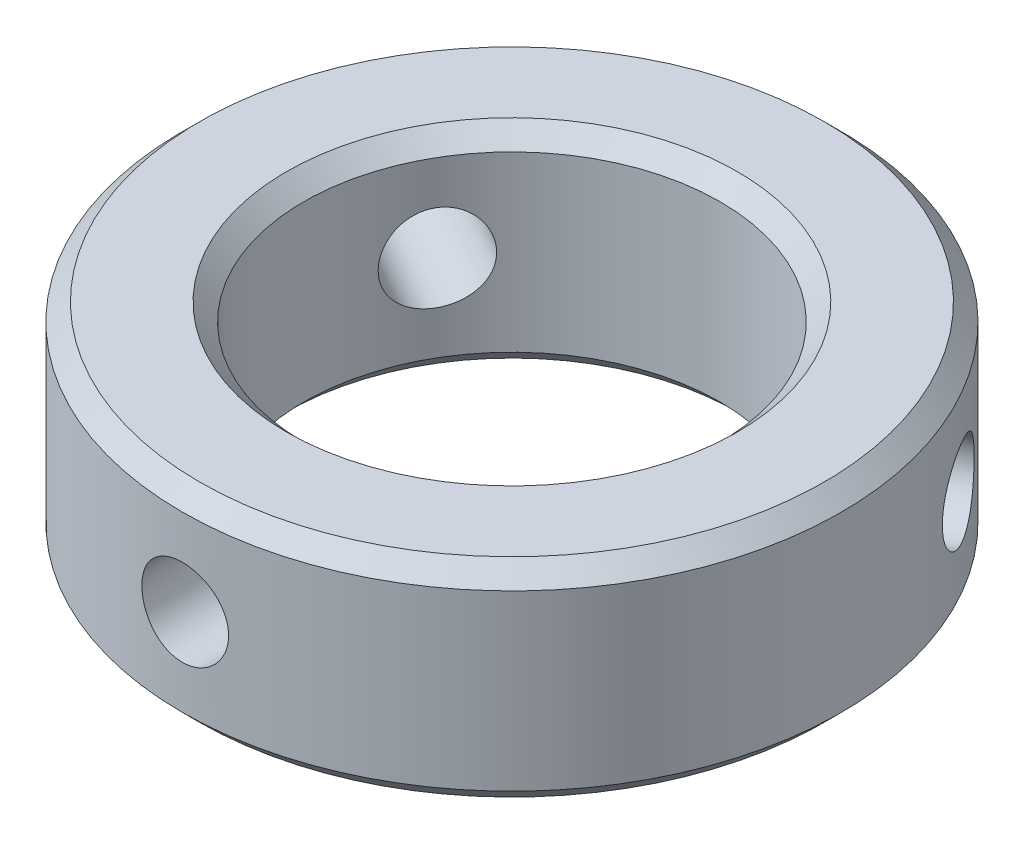
ISO-10303-21;
HEADER;
FILE_DESCRIPTION(('STEP AP214'),'2;1');
FILE_NAME('part.step','',(''),(''),'','','');
FILE_SCHEMA(('AUTOMOTIVE_DESIGN { 1 0 10303 214 1 1 1 1 }'));
ENDSEC;
DATA;
#1=APPLICATION_CONTEXT('core data for automotive mechanical design processes');
#2=APPLICATION_PROTOCOL_DEFINITION('international standard','automotive_design',2000,#1);
#3=PRODUCT_CONTEXT('',#1,'mechanical');
#4=PRODUCT('Part','Part','',(#3));
#5=PRODUCT_RELATED_PRODUCT_CATEGORY('part','',(#4));
#6=PRODUCT_DEFINITION_FORMATION('','',#4);
#7=PRODUCT_DEFINITION_CONTEXT('part definition',#1,'design');
#8=PRODUCT_DEFINITION('design','',#6,#7);
#9=PRODUCT_DEFINITION_SHAPE('','',#8);
#10=(LENGTH_UNIT() NAMED_UNIT(*) SI_UNIT(.MILLI.,.METRE.));
#11=(NAMED_UNIT(*) PLANE_ANGLE_UNIT() SI_UNIT($,.RADIAN.));
#12=(NAMED_UNIT(*) SI_UNIT($,.STERADIAN.) SOLID_ANGLE_UNIT());
#13=UNCERTAINTY_MEASURE_WITH_UNIT(LENGTH_MEASURE(1.E-05),#10,'distance_accuracy_value','');
#14=(GEOMETRIC_REPRESENTATION_CONTEXT(3) GLOBAL_UNCERTAINTY_ASSIGNED_CONTEXT((#13)) GLOBAL_UNIT_ASSIGNED_CONTEXT((#10,
#11,#12)) REPRESENTATION_CONTEXT('',''));
#15=CARTESIAN_POINT('',(0.,0.,0.));
#16=DIRECTION('',(0.,0.,1.));
#17=DIRECTION('',(1.,0.,0.));
#18=AXIS2_PLACEMENT_3D('',#15,#16,#17);
#19=CARTESIAN_POINT('',(0.,6.,0.));
#20=DIRECTION('',(0.,1.,0.));
#21=DIRECTION('',(0.,0.,1.));
#22=AXIS2_PLACEMENT_3D('',#19,#20,#21);
#23=PLANE('',#22);
#24=CARTESIAN_POINT('',(0.,6.,0.));
#25=DIRECTION('',(0.,1.,0.));
#26=DIRECTION('',(0.,0.,1.));
#27=AXIS2_PLACEMENT_3D('',#24,#25,#26);
#28=CIRCLE('',#27,9.);
#29=CARTESIAN_POINT('',(0.,6.,9.));
#30=VERTEX_POINT('',#29);
#31=EDGE_CURVE('E66',#30,#30,#28,.T.);
#32=ORIENTED_EDGE('',*,*,#31,.T.);
#33=EDGE_LOOP('',(#32));
#34=FACE_BOUND('',#33,.T.);
#35=CARTESIAN_POINT('',(0.,6.,0.));
#36=DIRECTION('',(0.,1.,0.));
#37=DIRECTION('',(0.,0.,1.));
#38=AXIS2_PLACEMENT_3D('',#35,#36,#37);
#39=CIRCLE('',#38,6.5);
#40=CARTESIAN_POINT('',(0.,6.,6.5));
#41=VERTEX_POINT('',#40);
#42=EDGE_CURVE('E79',#41,#41,#39,.F.);
#43=ORIENTED_EDGE('',*,*,#42,.T.);
#44=EDGE_LOOP('',(#43));
#45=FACE_BOUND('',#44,.T.);
#46=ADVANCED_FACE('F51',(#34,#45),#23,.T.);
#47=CARTESIAN_POINT('',(0.,0.,0.));
#48=DIRECTION('',(0.,1.,0.));
#49=DIRECTION('',(0.,0.,1.));
#50=AXIS2_PLACEMENT_3D('',#47,#48,#49);
#51=PLANE('',#50);
#52=CARTESIAN_POINT('',(0.,0.,0.));
#53=DIRECTION('',(0.,1.,0.));
#54=DIRECTION('',(0.,0.,1.));
#55=AXIS2_PLACEMENT_3D('',#52,#53,#54);
#56=CIRCLE('',#55,8.99999999999999);
#57=CARTESIAN_POINT('',(0.,0.,8.99999999999999));
#58=VERTEX_POINT('',#57);
#59=EDGE_CURVE('E10',#58,#58,#56,.F.);
#60=ORIENTED_EDGE('',*,*,#59,.T.);
#61=EDGE_LOOP('',(#60));
#62=FACE_BOUND('',#61,.T.);
#63=CARTESIAN_POINT('',(0.,0.,0.));
#64=DIRECTION('',(0.,1.,0.));
#65=DIRECTION('',(0.,0.,1.));
#66=AXIS2_PLACEMENT_3D('',#63,#64,#65);
#67=CIRCLE('',#66,6.5);
#68=CARTESIAN_POINT('',(0.,0.,6.5));
#69=VERTEX_POINT('',#68);
#70=EDGE_CURVE('E78',#69,#69,#67,.T.);
#71=ORIENTED_EDGE('',*,*,#70,.T.);
#72=EDGE_LOOP('',(#71));
#73=FACE_BOUND('',#72,.T.);
#74=ADVANCED_FACE('F173',(#62,#73),#51,.F.);
#75=CARTESIAN_POINT('',(0.,6.,0.));
#76=DIRECTION('',(0.,-1.,0.));
#77=DIRECTION('',(0.,0.,-1.));
#78=AXIS2_PLACEMENT_3D('',#75,#76,#77);
#79=CYLINDRICAL_SURFACE('',#78,9.5);
#80=CARTESIAN_POINT('',(0.,5.5,0.));
#81=DIRECTION('',(0.,1.,0.));
#82=DIRECTION('',(0.,0.,1.));
#83=AXIS2_PLACEMENT_3D('',#80,#81,#82);
#84=CIRCLE('',#83,9.5);
#85=CARTESIAN_POINT('',(0.,5.5,9.5));
#86=VERTEX_POINT('',#85);
#87=EDGE_CURVE('E58',#86,#86,#84,.F.);
#88=ORIENTED_EDGE('',*,*,#87,.T.);
#89=EDGE_LOOP('',(#88));
#90=FACE_BOUND('',#89,.T.);
#91=CARTESIAN_POINT('',(0.,0.500000000000002,0.));
#92=DIRECTION('',(0.,1.,0.));
#93=DIRECTION('',(0.,0.,1.));
#94=AXIS2_PLACEMENT_3D('',#91,#92,#93);
#95=CIRCLE('',#94,9.5);
#96=CARTESIAN_POINT('',(0.,0.500000000000002,9.5));
#97=VERTEX_POINT('',#96);
#98=EDGE_CURVE('E64',#97,#97,#95,.T.);
#99=ORIENTED_EDGE('',*,*,#98,.T.);
#100=EDGE_LOOP('',(#99));
#101=FACE_BOUND('',#100,.T.);
#102=CARTESIAN_POINT('',(-8.78071118909936,3.,-3.62617029572871));
#103=CARTESIAN_POINT('',(-8.78071062192974,2.93011379465119,-3.62617337707279));
#104=CARTESIAN_POINT('',(-8.77845183588832,2.86018467255548,-3.63165628806873));
#105=CARTESIAN_POINT('',(-8.76942082051617,2.72227477521103,-3.65340824645389));
#106=CARTESIAN_POINT('',(-8.76264395198733,2.65429607758202,-3.66968838041604));
#107=CARTESIAN_POINT('',(-8.74461341772239,2.52230357984593,-3.71244812572698));
#108=CARTESIAN_POINT('',(-8.73336288773791,2.45828703876486,-3.73892059248818));
#109=CARTESIAN_POINT('',(-8.70645704664054,2.33596492220363,-3.8011510688992));
#110=CARTESIAN_POINT('',(-8.69080245227795,2.27765841950908,-3.83690756752345));
#111=CARTESIAN_POINT('',(-8.65511491838587,2.16803949801496,-3.91674644637752));
#112=CARTESIAN_POINT('',(-8.63505825191682,2.11676752761631,-3.96087376286224));
#113=CARTESIAN_POINT('',(-8.59083304814015,2.02302277326857,-4.05590045883485));
#114=CARTESIAN_POINT('',(-8.56666430124152,1.98055043807805,-4.10680018348072));
#115=CARTESIAN_POINT('',(-8.5144604687163,1.90546437122733,-4.21396760564728));
#116=CARTESIAN_POINT('',(-8.48641150912022,1.87288742035881,-4.27025433164816));
#117=CARTESIAN_POINT('',(-8.42702440425391,1.81875255294734,-4.38628571652425));
#118=CARTESIAN_POINT('',(-8.39568639377068,1.79719418506955,-4.44603023365242));
#119=CARTESIAN_POINT('',(-8.33060683849444,1.76582977739799,-4.56680033691128));
#120=CARTESIAN_POINT('',(-8.29688027763635,1.75595634411622,-4.62781649072268));
#121=CARTESIAN_POINT('',(-8.22773742309012,1.74803311553219,-4.74965704136351));
#122=CARTESIAN_POINT('',(-8.19232120270669,1.7499828077537,-4.81048144638999));
#123=CARTESIAN_POINT('',(-8.12105846976186,1.76559667926435,-4.92982880644937));
#124=CARTESIAN_POINT('',(-8.08521597019457,1.77918837290104,-4.98836366348031));
#125=CARTESIAN_POINT('',(-8.01402502069592,1.81758700356617,-5.1019504801891));
#126=CARTESIAN_POINT('',(-7.97867658101959,1.84239417303489,-5.15700236765559));
#127=CARTESIAN_POINT('',(-7.90957598579334,1.90259594273984,-5.26237527375157));
#128=CARTESIAN_POINT('',(-7.87582887127691,1.93802170098393,-5.31268178895683));
#129=CARTESIAN_POINT('',(-7.81126524033703,2.01843235628981,-5.40716328155282));
#130=CARTESIAN_POINT('',(-7.78044887287587,2.06341773886708,-5.4513379473299));
#131=CARTESIAN_POINT('',(-7.72270518332515,2.16207612684237,-5.53284224667362));
#132=CARTESIAN_POINT('',(-7.69580907517274,2.2158123342479,-5.57011751823329));
#133=CARTESIAN_POINT('',(-7.6472828811896,2.33023047618093,-5.63655590534409));
#134=CARTESIAN_POINT('',(-7.62565281524948,2.39091243694228,-5.66571899025436));
#135=CARTESIAN_POINT('',(-7.5885753496897,2.51755772705051,-5.71528541842193));
#136=CARTESIAN_POINT('',(-7.57313105959658,2.5835236926697,-5.73568435640538));
#137=CARTESIAN_POINT('',(-7.5491336606266,2.71883386407496,-5.76723308831741));
#138=CARTESIAN_POINT('',(-7.54058018237586,2.78817788857281,-5.77838337800989));
#139=CARTESIAN_POINT('',(-7.53079522439986,2.92772111469758,-5.79113015261714));
#140=CARTESIAN_POINT('',(-7.52950952652376,2.99791005866249,-5.7927973824057));
#141=CARTESIAN_POINT('',(-7.53417388024769,3.13763655644785,-5.78672947455716));
#142=CARTESIAN_POINT('',(-7.54012376049581,3.20717412565477,-5.77899455958029));
#143=CARTESIAN_POINT('',(-7.55895011395923,3.34335692266034,-5.7543470273212));
#144=CARTESIAN_POINT('',(-7.57180042700378,3.41001205346481,-5.7374690700325));
#145=CARTESIAN_POINT('',(-7.60384054286861,3.53884829537357,-5.69493755147116));
#146=CARTESIAN_POINT('',(-7.62303059104764,3.60102923320539,-5.66928365055292));
#147=CARTESIAN_POINT('',(-7.66706059742711,3.71955093973817,-5.6095953466903));
#148=CARTESIAN_POINT('',(-7.69193288194551,3.77585549888484,-5.57551289840223));
#149=CARTESIAN_POINT('',(-7.74624157845442,3.88065603112854,-5.49980964014213));
#150=CARTESIAN_POINT('',(-7.77567818758482,3.92915166676215,-5.45818850455006));
#151=CARTESIAN_POINT('',(-7.8381625161471,4.01726989431143,-5.36807486398728));
#152=CARTESIAN_POINT('',(-7.8712319436772,4.05683429095804,-5.31954047363179));
#153=CARTESIAN_POINT('',(-7.93958199655452,4.12556359939876,-5.21697520040422));
#154=CARTESIAN_POINT('',(-7.97486257324442,4.15472873993872,-5.16294443846593));
#155=CARTESIAN_POINT('',(-8.04627169420194,4.20173630666017,-5.05093126300279));
#156=CARTESIAN_POINT('',(-8.08239742653864,4.21961191690474,-4.99296099078907));
#157=CARTESIAN_POINT('',(-8.15439479277473,4.2436408257752,-4.87448946145042));
#158=CARTESIAN_POINT('',(-8.19026643934441,4.24979471307749,-4.81398833158361));
#159=CARTESIAN_POINT('',(-8.2603938386395,4.25019366185716,-4.69262918933037));
#160=CARTESIAN_POINT('',(-8.29465974658013,4.24452828407511,-4.63177732011108));
#161=CARTESIAN_POINT('',(-8.36094163626228,4.22163976918598,-4.51103092331503));
#162=CARTESIAN_POINT('',(-8.39295762079822,4.20441664643407,-4.45113639454931));
#163=CARTESIAN_POINT('',(-8.45398387233231,4.15893059252178,-4.33411046165837));
#164=CARTESIAN_POINT('',(-8.48299543066811,4.13067242947669,-4.27697787609481));
#165=CARTESIAN_POINT('',(-8.53747215854278,4.06392774970724,-4.16717294247801));
#166=CARTESIAN_POINT('',(-8.5629372675857,4.02544105853544,-4.11450067051559));
#167=CARTESIAN_POINT('',(-8.61010144688856,3.93900219469073,-4.01487455419204));
#168=CARTESIAN_POINT('',(-8.63177190291553,3.89098348067507,-3.96796489303616));
#169=CARTESIAN_POINT('',(-8.67086329172112,3.78698264817583,-3.88180041075255));
#170=CARTESIAN_POINT('',(-8.68828321964538,3.73099865158669,-3.84254740014924));
#171=CARTESIAN_POINT('',(-8.71877399401483,3.61237952083109,-3.77285536179909));
#172=CARTESIAN_POINT('',(-8.73182591390284,3.54971695441198,-3.74245476349173));
#173=CARTESIAN_POINT('',(-8.75337672536822,3.41974623395631,-3.69176938492731));
#174=CARTESIAN_POINT('',(-8.76188051400784,3.35244316497739,-3.67147372611727));
#175=CARTESIAN_POINT('',(-8.77229670721094,3.23733543112762,-3.64649471967978));
#176=CARTESIAN_POINT('',(-8.77545088955714,3.19025340647348,-3.63888612956467));
#177=CARTESIAN_POINT('',(-8.77965831499338,3.0954542589192,-3.6287228873729));
#178=CARTESIAN_POINT('',(-8.78071157651568,3.04773714159469,-3.62616819095628));
#179=CARTESIAN_POINT('',(-8.78071118909936,3.,-3.62617029572871));
#180=B_SPLINE_CURVE_WITH_KNOTS('',3,(#102,#103,#104,#105,#106,#107,#108,#109,#110,#111,#112,
#113,#114,#115,#116,#117,#118,#119,#120,#121,#122,#123,#124,#125,#126,#127,#128,#129,#130,#131,
#132,#133,#134,#135,#136,#137,#138,#139,#140,#141,#142,#143,#144,#145,#146,#147,#148,#149,#150,
#151,#152,#153,#154,#155,#156,#157,#158,#159,#160,#161,#162,#163,#164,#165,#166,#167,#168,#169,
#170,#171,#172,#173,#174,#175,#176,#177,#178,#179),.UNSPECIFIED.,.T.,.F.,(4,2,2,2,2,2,2,2,2,2,2,
2,2,2,2,2,2,2,2,2,2,2,2,2,2,2,2,2,2,2,2,2,2,2,2,2,2,2,4),(0.,0.209484202571715,
0.419183836928699,0.628736743572667,0.838255565722025,1.04893269923857,1.25962057409929,
1.47108224647857,1.68253525643094,1.89276266234727,2.10298095597088,2.31189982011464,
2.5208230142918,2.73036535278699,2.93991833609116,3.15105801722779,3.36219849585734,
3.57344497984326,3.78468013945544,3.99433736908824,4.20398963374582,4.41285264161178,
4.62172373378567,4.83181406846405,5.04191347978169,5.25334471898747,5.46477130718732,
5.67557350690563,5.88636511965188,6.09556525763886,6.30476513579181,6.5138747208992,
6.72298787259743,6.93361567574771,7.14429322463351,7.35587216352337,7.56722283023421,
7.7103163739037,7.85340866214721),.UNSPECIFIED.);
#181=CARTESIAN_POINT('',(-8.78071118909936,3.,-3.62617029572871));
#182=VERTEX_POINT('',#181);
#183=EDGE_CURVE('E95',#182,#182,#180,.T.);
#184=ORIENTED_EDGE('',*,*,#183,.T.);
#185=EDGE_LOOP('',(#184));
#186=FACE_BOUND('',#185,.T.);
#187=CARTESIAN_POINT('',(7.5307111890993,3.,-5.79123380518992));
#188=CARTESIAN_POINT('',(7.53071357403674,2.93011379465119,-5.79123177333459));
#189=CARTESIAN_POINT('',(7.53433252122521,2.86018467255548,-5.78653415174303));
#190=CARTESIAN_POINT('',(7.54865476208274,2.72227477521103,-5.7678370838162));
#191=CARTESIAN_POINT('',(7.55936533740655,2.65429607758202,-5.75382807653104));
#192=CARTESIAN_POINT('',(7.58738109597271,2.52230357984593,-5.71683330315832));
#193=CARTESIAN_POINT('',(7.60468165969651,2.45828703876486,-5.69385382500513));
#194=CARTESIAN_POINT('',(7.64512191260937,2.33596492220363,-5.63943744489911));
#195=CARTESIAN_POINT('',(7.66826065158707,2.27765841950908,-5.60800191918304));
#196=CARTESIAN_POINT('',(7.71955938193832,2.16803949801496,-5.53717616880705));
#197=CARTESIAN_POINT('',(7.74774642578039,2.11676752761631,-5.49774292788725));
#198=CARTESIAN_POINT('',(7.80792935664204,2.02302277326857,-5.41192942994281));
#199=CARTESIAN_POINT('',(7.83992543778168,1.98055043807805,-5.36554881882802));
#200=CARTESIAN_POINT('',(7.90663323157341,1.90546437122733,-5.266755262603));
#201=CARTESIAN_POINT('',(7.94135448638798,1.87288742035881,-5.21432078804263));
#202=CARTESIAN_POINT('',(8.0121470608938,1.81875255294734,-5.10487435413315));
#203=CARTESIAN_POINT('',(8.04821832522202,1.79719418506955,-5.04786258238653));
#204=CARTESIAN_POINT('',(8.12026852502374,1.76582977739799,-4.93111698262088));
#205=CARTESIAN_POINT('',(8.15624678383659,1.75595634411622,-4.87140084722979));
#206=CARTESIAN_POINT('',(8.22719236862951,1.74803311553219,-4.75060110338216));
#207=CARTESIAN_POINT('',(8.26215973836081,1.7499828077537,-4.68951755431085));
#208=CARTESIAN_POINT('',(8.32988621757442,1.76559667926435,-4.56812853720783));
#209=CARTESIAN_POINT('',(8.36265764098646,1.77918837290104,-4.50782059353195));
#210=CARTESIAN_POINT('',(8.42543123504196,1.81758700356617,-4.38937401439219));
#211=CARTESIAN_POINT('',(8.45543334827606,1.84239417303489,-4.3312354239151));
#212=CARTESIAN_POINT('',(8.51213866421264,1.90259594273984,-4.21870609998456));
#213=CARTESIAN_POINT('',(8.53883182709805,1.93802170098393,-4.16432698390627));
#214=CARTESIAN_POINT('',(8.5883733844037,2.01843235628981,-4.06117249305378));
#215=CARTESIAN_POINT('',(8.61122158343976,2.06341773886708,-4.01239740309152));
#216=CARTESIAN_POINT('',(8.65293453241371,2.16207612684237,-3.92163775136049));
#217=CARTESIAN_POINT('',(8.67176781044115,2.2158123342479,-3.87970740265773));
#218=CARTESIAN_POINT('',(8.70504204447399,2.33023047618093,-3.80446329236397));
#219=CARTESIAN_POINT('',(8.71948298388895,2.39091243694228,-3.77114956331916));
#220=CARTESIAN_POINT('',(8.74387003707703,2.51755772705051,-3.71425632215266));
#221=CARTESIAN_POINT('',(8.75381389053437,2.5835236926697,-3.69068170559687));
#222=CARTESIAN_POINT('',(8.76913719434238,2.71883386407496,-3.6541249825081));
#223=CARTESIAN_POINT('',(8.77451688935025,2.78817788857281,-3.641142308206));
#224=CARTESIAN_POINT('',(8.78066344098844,2.92772111469758,-3.6262948987202));
#225=CARTESIAN_POINT('',(8.78146445540123,2.99791005866249,-3.62434783680363));
#226=CARTESIAN_POINT('',(8.77854166991854,3.13763655644785,-3.63142123954505));
#227=CARTESIAN_POINT('',(8.77481797717652,3.20717412565477,-3.64044144447784));
#228=CARTESIAN_POINT('',(8.76288576483126,3.34335692266034,-3.66906931096733));
#229=CARTESIAN_POINT('',(8.75469418157753,3.41001205346481,-3.68863698715485));
#230=CARTESIAN_POINT('',(8.7338808639743,3.53884829537357,-3.73765030071466));
#231=CARTESIAN_POINT('',(8.72125895816244,3.60102923320539,-3.76709632039666));
#232=CARTESIAN_POINT('',(8.69158237389835,3.71955093973817,-3.83507157638138));
#233=CARTESIAN_POINT('',(8.67450225011691,3.77585549888484,-3.8736528307685));
#234=CARTESIAN_POINT('',(8.63609565356886,3.88065603112854,-3.95853717072169));
#235=CARTESIAN_POINT('',(8.61476899737698,3.92915166676215,-4.00484058982593));
#236=CARTESIAN_POINT('',(8.56797045970324,4.01726989431143,-4.10401042598066));
#237=CARTESIAN_POINT('',(8.54247315846325,4.05683429095804,-4.15691658548808));
#238=CARTESIAN_POINT('',(8.48782405274074,4.12556359939876,-4.26739210424364));
#239=CARTESIAN_POINT('',(8.45867232866131,4.15472873993872,-4.3249613608864));
#240=CARTESIAN_POINT('',(8.39737063363043,4.20173630666017,-4.4428100614291));
#241=CARTESIAN_POINT('',(8.36522977139739,4.21961191690474,-4.50308099946986));
#242=CARTESIAN_POINT('',(8.29862910048298,4.2436408257752,-4.62466831230521));
#243=CARTESIAN_POINT('',(8.2641694083455,4.24979471307749,-4.68598463444354));
#244=CARTESIAN_POINT('',(8.19413300782025,4.25019366185716,-4.80739631486104));
#245=CARTESIAN_POINT('',(8.15856669717889,4.24452828407511,-4.86749739623101));
#246=CARTESIAN_POINT('',(8.08713819497915,4.22163976918598,-4.98527239490461));
#247=CARTESIAN_POINT('',(8.05127600378831,4.20441664643407,-5.04294631522277));
#248=CARTESIAN_POINT('',(7.98044169877023,4.15893059252178,-5.1543095657945));
#249=CARTESIAN_POINT('',(7.94546920745619,4.13067242947669,-5.20800060509846));
#250=CARTESIAN_POINT('',(7.87761370942052,4.06392774970724,-5.31008130216137));
#251=CARTESIAN_POINT('',(7.84473073834748,4.02544105853544,-5.3584708694839));
#252=CARTESIAN_POINT('',(7.78203408038234,3.93900219469073,-5.44912930507059));
#253=CARTESIAN_POINT('',(7.75224435015191,3.89098348067507,-5.49135130107949));
#254=CARTESIAN_POINT('',(7.69716941399316,3.78698264817582,-5.56828767799614));
#255=CARTESIAN_POINT('',(7.67188527359781,3.73099865158669,-5.6030002834123));
#256=CARTESIAN_POINT('',(7.62677558512978,3.61237952083108,-5.66425208777238));
#257=CARTESIAN_POINT('',(7.60697385464937,3.54971695441198,-5.69075568111723));
#258=CARTESIAN_POINT('',(7.57385443494484,3.41974623395631,-5.73476192060063));
#259=CARTESIAN_POINT('',(7.56052977314861,3.35244316497739,-5.75227424699597));
#260=CARTESIAN_POINT('',(7.544105415614,3.23733543112762,-5.77378443813933));
#261=CARTESIAN_POINT('',(7.53909327446043,3.19025340647348,-5.78032033523686));
#262=CARTESIAN_POINT('',(7.53239536125567,3.0954542589192,-5.78904569364506));
#263=CARTESIAN_POINT('',(7.53070956002107,3.04773714159469,-5.79123519308851));
#264=CARTESIAN_POINT('',(7.5307111890993,3.,-5.79123380518992));
#265=B_SPLINE_CURVE_WITH_KNOTS('',3,(#187,#188,#189,#190,#191,#192,#193,#194,#195,#196,#197,
#198,#199,#200,#201,#202,#203,#204,#205,#206,#207,#208,#209,#210,#211,#212,#213,#214,#215,#216,
#217,#218,#219,#220,#221,#222,#223,#224,#225,#226,#227,#228,#229,#230,#231,#232,#233,#234,#235,
#236,#237,#238,#239,#240,#241,#242,#243,#244,#245,#246,#247,#248,#249,#250,#251,#252,#253,#254,
#255,#256,#257,#258,#259,#260,#261,#262,#263,#264),.UNSPECIFIED.,.T.,.F.,(4,2,2,2,2,2,2,2,2,2,2,
2,2,2,2,2,2,2,2,2,2,2,2,2,2,2,2,2,2,2,2,2,2,2,2,2,2,2,4),(0.,0.209484202571715,
0.419183836928699,0.628736743572667,0.838255565722025,1.04893269923857,1.25962057409929,
1.47108224647857,1.68253525643094,1.89276266234727,2.10298095597087,2.31189982011463,
2.5208230142918,2.73036535278698,2.93991833609116,3.15105801722779,3.36219849585734,
3.57344497984326,3.78468013945544,3.99433736908824,4.20398963374582,4.41285264161178,
4.62172373378567,4.83181406846405,5.04191347978168,5.25334471898747,5.46477130718732,
5.67557350690563,5.88636511965188,6.09556525763886,6.30476513579181,6.5138747208992,
6.72298787259743,6.93361567574771,7.14429322463351,7.35587216352337,7.56722283023421,
7.7103163739037,7.85340866214721),.UNSPECIFIED.);
#266=CARTESIAN_POINT('',(7.5307111890993,3.,-5.79123380518992));
#267=VERTEX_POINT('',#266);
#268=EDGE_CURVE('E101',#267,#267,#265,.T.);
#269=ORIENTED_EDGE('',*,*,#268,.T.);
#270=EDGE_LOOP('',(#269));
#271=FACE_BOUND('',#270,.T.);
#272=CARTESIAN_POINT('',(1.25,3.,9.41740410091868));
#273=CARTESIAN_POINT('',(1.24999704789294,2.93011379465119,9.41740515040742));
#274=CARTESIAN_POINT('',(1.24411931466306,2.86018467255548,9.41819043981181));
#275=CARTESIAN_POINT('',(1.22076605843337,2.72227477521103,9.42124533027014));
#276=CARTESIAN_POINT('',(1.20327861458071,2.65429607758202,9.42351645694713));
#277=CARTESIAN_POINT('',(1.15723232174961,2.52230357984593,9.42928142888536));
#278=CARTESIAN_POINT('',(1.12868122804134,2.45828703876486,9.43277441749336));
#279=CARTESIAN_POINT('',(1.06133513403111,2.33596492220363,9.44058851379835));
#280=CARTESIAN_POINT('',(1.02254180069082,2.27765841950908,9.44490948670654));
#281=CARTESIAN_POINT('',(0.935555536447495,2.16803949801496,9.45392261518461));
#282=CARTESIAN_POINT('',(0.887311826136364,2.11676752761631,9.45861669074954));
#283=CARTESIAN_POINT('',(0.782903691498048,2.02302277326857,9.4678298887777));
#284=CARTESIAN_POINT('',(0.726738863459773,1.98055043807805,9.47234900230879));
#285=CARTESIAN_POINT('',(0.607827237142835,1.90546437122733,9.48072286825033));
#286=CARTESIAN_POINT('',(0.545057022732175,1.87288742035881,9.48457511969083));
#287=CARTESIAN_POINT('',(0.414877343360044,1.81875255294734,9.49116007065744));
#288=CARTESIAN_POINT('',(0.3474680685486,1.79719418506955,9.49389281603898));
#289=CARTESIAN_POINT('',(0.210338313470635,1.76582977739799,9.4979173195322));
#290=CARTESIAN_POINT('',(0.140633493799697,1.75595634411622,9.4992173379525));
#291=CARTESIAN_POINT('',(0.00054505446053656,1.74803311553219,9.50025814474571));
#292=CARTESIAN_POINT('',(-0.0698385356541859,1.7499828077537,9.49999900070087));
#293=CARTESIAN_POINT('',(-0.20882774781263,1.76559667926435,9.49795734365723));
#294=CARTESIAN_POINT('',(-0.27744167079196,1.77918837290104,9.4961842570123));
#295=CARTESIAN_POINT('',(-0.411406214346103,1.81758700356617,9.49132449458133));
#296=CARTESIAN_POINT('',(-0.476756767256533,1.84239417303489,9.48823779157073));
#297=CARTESIAN_POINT('',(-0.602562678419365,1.90259594273984,9.48108137373616));
#298=CARTESIAN_POINT('',(-0.663002955821205,1.93802170098393,9.47700877286313));
#299=CARTESIAN_POINT('',(-0.777108144066743,2.01843235628981,9.46833577460663));
#300=CARTESIAN_POINT('',(-0.83077271056396,2.06341773886708,9.46373535042145));
#301=CARTESIAN_POINT('',(-0.930229349088633,2.16207612684237,9.45447999803414));
#302=CARTESIAN_POINT('',(-0.975958735268481,2.2158123342479,9.44982492089105));
#303=CARTESIAN_POINT('',(-1.05775916328446,2.33023047618093,9.44101919770808));
#304=CARTESIAN_POINT('',(-1.09383016863954,2.39091243694228,9.43686855357354));
#305=CARTESIAN_POINT('',(-1.1552946873874,2.51755772705051,9.42954174057461));
#306=CARTESIAN_POINT('',(-1.18068283093786,2.5835236926697,9.42636606200228));
#307=CARTESIAN_POINT('',(-1.22000353371585,2.71883386407496,9.42135807082555));
#308=CARTESIAN_POINT('',(-1.23393670697446,2.78817788857281,9.41952568621592));
#309=CARTESIAN_POINT('',(-1.24986821658865,2.92772111469758,9.41742505133737));
#310=CARTESIAN_POINT('',(-1.25195492887754,2.99791005866249,9.41714521920936));
#311=CARTESIAN_POINT('',(-1.24436778967092,3.13763655644785,9.41815071410225));
#312=CARTESIAN_POINT('',(-1.23469421668077,3.20717412565477,9.41943600405816));
#313=CARTESIAN_POINT('',(-1.2039356508721,3.34335692266034,9.42341633828856));
#314=CARTESIAN_POINT('',(-1.18289375457382,3.41001205346481,9.42610605718737));
#315=CARTESIAN_POINT('',(-1.13004032110575,3.53884829537357,9.43258785218585));
#316=CARTESIAN_POINT('',(-1.09822836711488,3.60102923320539,9.43637997094961));
#317=CARTESIAN_POINT('',(-1.02452177647131,3.71955093973816,9.44466692307171));
#318=CARTESIAN_POINT('',(-0.982569368171472,3.77585549888484,9.44916572917077));
#319=CARTESIAN_POINT('',(-0.889854075114515,3.88065603112854,9.45834681086385));
#320=CARTESIAN_POINT('',(-0.83909080979222,3.92915166676215,9.46302909437602));
#321=CARTESIAN_POINT('',(-0.729807943556216,4.01726989431143,9.47208528996797));
#322=CARTESIAN_POINT('',(-0.671241214786125,4.05683429095804,9.47645705911991));
#323=CARTESIAN_POINT('',(-0.548242056186292,4.12556359939876,9.48436730464789));
#324=CARTESIAN_POINT('',(-0.48380975541696,4.15472873993872,9.48790579935237));
#325=CARTESIAN_POINT('',(-0.35109893942855,4.20173630666017,9.49374132443193));
#326=CARTESIAN_POINT('',(-0.28283234485882,4.21961191690474,9.49604199025896));
#327=CARTESIAN_POINT('',(-0.144234307708316,4.2436408257752,9.49915777375567));
#328=CARTESIAN_POINT('',(-0.0739029690011531,4.24979471307749,9.49997296602718));
#329=CARTESIAN_POINT('',(0.0662608308191816,4.25019366185716,9.50002550419145));
#330=CARTESIAN_POINT('',(0.136093049401174,4.24452828407511,9.49927471634213));
#331=CARTESIAN_POINT('',(0.273803441283064,4.22163976918598,9.49630331821968));
#332=CARTESIAN_POINT('',(0.341681617009847,4.20441664643407,9.49408270977212));
#333=CARTESIAN_POINT('',(0.473542173562016,4.15893059252178,9.48842002745291));
#334=CARTESIAN_POINT('',(0.537526223211852,4.13067242947669,9.4849784811933));
#335=CARTESIAN_POINT('',(0.659858449122197,4.06392774970724,9.47725424463942));
#336=CARTESIAN_POINT('',(0.718206529238157,4.02544105853544,9.47297153999953));
#337=CARTESIAN_POINT('',(0.828067366506166,3.93900219469073,9.46400385926268));
#338=CARTESIAN_POINT('',(0.879527552763564,3.89098348067507,9.45931619411569));
#339=CARTESIAN_POINT('',(0.9736938777279,3.78698264817582,9.45008808874873));
#340=CARTESIAN_POINT('',(1.01639794604752,3.73099865158669,9.44554768356159));
#341=CARTESIAN_POINT('',(1.09199840888499,3.61237952083108,9.43710744957151));
#342=CARTESIAN_POINT('',(1.12485205925341,3.54971695441198,9.43321044460901));
#343=CARTESIAN_POINT('',(1.17952229042332,3.41974623395631,9.42653130552799));
#344=CARTESIAN_POINT('',(1.20135074085917,3.35244316497739,9.42374797311328));
#345=CARTESIAN_POINT('',(1.22819129159688,3.23733543112762,9.42027915781915));
#346=CARTESIAN_POINT('',(1.23635761509664,3.19025340647348,9.41920646480158));
#347=CARTESIAN_POINT('',(1.24726295373765,3.0954542589192,9.41776858101801));
#348=CARTESIAN_POINT('',(1.25000201649455,3.04773714159469,9.41740338404484));
#349=CARTESIAN_POINT('',(1.25,3.,9.41740410091868));
#350=B_SPLINE_CURVE_WITH_KNOTS('',3,(#272,#273,#274,#275,#276,#277,#278,#279,#280,#281,#282,
#283,#284,#285,#286,#287,#288,#289,#290,#291,#292,#293,#294,#295,#296,#297,#298,#299,#300,#301,
#302,#303,#304,#305,#306,#307,#308,#309,#310,#311,#312,#313,#314,#315,#316,#317,#318,#319,#320,
#321,#322,#323,#324,#325,#326,#327,#328,#329,#330,#331,#332,#333,#334,#335,#336,#337,#338,#339,
#340,#341,#342,#343,#344,#345,#346,#347,#348,#349),.UNSPECIFIED.,.T.,.F.,(4,2,2,2,2,2,2,2,2,2,2,
2,2,2,2,2,2,2,2,2,2,2,2,2,2,2,2,2,2,2,2,2,2,2,2,2,2,2,4),(0.,0.209484202571714,
0.419183836928699,0.628736743572667,0.838255565722023,1.04893269923857,1.25962057409929,
1.47108224647857,1.68253525643094,1.89276266234727,2.10298095597088,2.31189982011463,
2.5208230142918,2.73036535278698,2.93991833609116,3.15105801722779,3.36219849585734,
3.57344497984326,3.78468013945544,3.99433736908824,4.20398963374582,4.41285264161178,
4.62172373378567,4.83181406846404,5.04191347978168,5.25334471898747,5.46477130718732,
5.67557350690563,5.88636511965188,6.09556525763885,6.30476513579181,6.5138747208992,
6.72298787259742,6.93361567574771,7.14429322463351,7.35587216352337,7.56722283023421,
7.7103163739037,7.85340866214721),.UNSPECIFIED.);
#351=CARTESIAN_POINT('',(1.25,3.,9.41740410091868));
#352=VERTEX_POINT('',#351);
#353=EDGE_CURVE('E149',#352,#352,#350,.T.);
#354=ORIENTED_EDGE('',*,*,#353,.T.);
#355=EDGE_LOOP('',(#354));
#356=FACE_BOUND('',#355,.T.);
#357=ADVANCED_FACE('F110',(#90,#101,#186,#271,#356),#79,.T.);
#358=CARTESIAN_POINT('',(0.,6.,0.));
#359=DIRECTION('',(0.,-1.,0.));
#360=DIRECTION('',(0.,0.,-1.));
#361=AXIS2_PLACEMENT_3D('',#358,#359,#360);
#362=CYLINDRICAL_SURFACE('',#361,6.);
#363=CARTESIAN_POINT('',(0.,5.5,0.));
#364=DIRECTION('',(0.,1.,0.));
#365=DIRECTION('',(0.,0.,1.));
#366=AXIS2_PLACEMENT_3D('',#363,#364,#365);
#367=CIRCLE('',#366,6.);
#368=CARTESIAN_POINT('',(0.,5.5,6.));
#369=VERTEX_POINT('',#368);
#370=EDGE_CURVE('E85',#369,#369,#367,.T.);
#371=ORIENTED_EDGE('',*,*,#370,.T.);
#372=EDGE_LOOP('',(#371));
#373=FACE_BOUND('',#372,.T.);
#374=CARTESIAN_POINT('',(0.,0.500000000000006,0.));
#375=DIRECTION('',(0.,1.,0.));
#376=DIRECTION('',(0.,0.,1.));
#377=AXIS2_PLACEMENT_3D('',#374,#375,#376);
#378=CIRCLE('',#377,6.);
#379=CARTESIAN_POINT('',(0.,0.500000000000006,6.));
#380=VERTEX_POINT('',#379);
#381=EDGE_CURVE('E86',#380,#380,#378,.F.);
#382=ORIENTED_EDGE('',*,*,#381,.T.);
#383=EDGE_LOOP('',(#382));
#384=FACE_BOUND('',#383,.T.);
#385=CARTESIAN_POINT('',(-5.70713783756405,3.,-1.85164189384578));
#386=CARTESIAN_POINT('',(-5.70713780004337,2.93060938484897,-1.8516447488009));
#387=CARTESIAN_POINT('',(-5.70531646071248,2.86118802798478,-1.8572849352778));
#388=CARTESIAN_POINT('',(-5.69799533361062,2.72431368268275,-1.87962289253197));
#389=CARTESIAN_POINT('',(-5.69249272612532,2.65686224449358,-1.89632913940243));
#390=CARTESIAN_POINT('',(-5.67772267928028,2.52592762716513,-1.94010170743905));
#391=CARTESIAN_POINT('',(-5.66845915141677,2.4624404040082,-1.96715726325628));
#392=CARTESIAN_POINT('',(-5.64604204458465,2.3410755003544,-2.03059994382413));
#393=CARTESIAN_POINT('',(-5.6328886228348,2.28319759326998,-2.06698669142587));
#394=CARTESIAN_POINT('',(-5.60235819594924,2.17380462484654,-2.14836965564533));
#395=CARTESIAN_POINT('',(-5.58492554938411,2.12238810637353,-2.19347747943796));
#396=CARTESIAN_POINT('',(-5.54586370818435,2.0282389313519,-2.29044162162386));
#397=CARTESIAN_POINT('',(-5.52423420598722,1.98550691170856,-2.34229843451851));
#398=CARTESIAN_POINT('',(-5.47661070372347,1.90955411191714,-2.45159471025236));
#399=CARTESIAN_POINT('',(-5.45057722040211,1.87642747353674,-2.50908249631084));
#400=CARTESIAN_POINT('',(-5.39456233793638,1.82123394714022,-2.62735089296269));
#401=CARTESIAN_POINT('',(-5.36458134050839,1.79916593484647,-2.68813116812796));
#402=CARTESIAN_POINT('',(-5.3016645932396,1.76702423888253,-2.8101593576636));
#403=CARTESIAN_POINT('',(-5.26877708169102,1.75678398280484,-2.87138823995521));
#404=CARTESIAN_POINT('',(-5.20049573226464,1.74806830424298,-2.99327941878478));
#405=CARTESIAN_POINT('',(-5.1651021559389,1.7495916558069,-3.05394177370407));
#406=CARTESIAN_POINT('',(-5.09343139364268,1.76423460095674,-3.17201120315475));
#407=CARTESIAN_POINT('',(-5.05717629948895,1.77717471895812,-3.22945408558366));
#408=CARTESIAN_POINT('',(-4.98446882146392,1.81399862533131,-3.34058117045924));
#409=CARTESIAN_POINT('',(-4.94801642930137,1.83788287720308,-3.39426521360258));
#410=CARTESIAN_POINT('',(-4.87598753360544,1.8960800521255,-3.49695720120141));
#411=CARTESIAN_POINT('',(-4.84041860504092,1.93046229420966,-3.5459311286744));
#412=CARTESIAN_POINT('',(-4.77179348095366,2.00862800284042,-3.63775725656609));
#413=CARTESIAN_POINT('',(-4.73873759852211,2.05241263820613,-3.6806086947893));
#414=CARTESIAN_POINT('',(-4.6759152545535,2.14912162489105,-3.76011121189251));
#415=CARTESIAN_POINT('',(-4.64622276092682,2.20220305998195,-3.79662981431034));
#416=CARTESIAN_POINT('',(-4.59222641316152,2.3154820489948,-3.8617679855244));
#417=CARTESIAN_POINT('',(-4.56792267905842,2.37567976138723,-3.89038737836791));
#418=CARTESIAN_POINT('',(-4.5258550867197,2.5017122548288,-3.93924901029057));
#419=CARTESIAN_POINT('',(-4.5081076032484,2.56756065069343,-3.95947028982873));
#420=CARTESIAN_POINT('',(-4.4801936431478,2.70289161936938,-3.99102911052813));
#421=CARTESIAN_POINT('',(-4.47002608624267,2.77237367280809,-4.0023679176131));
#422=CARTESIAN_POINT('',(-4.45795914836417,2.91161970631891,-4.01580392174945));
#423=CARTESIAN_POINT('',(-4.45590999307886,2.98135458453703,-4.01806853530304));
#424=CARTESIAN_POINT('',(-4.45978143640287,3.12032581154014,-4.01377100187183));
#425=CARTESIAN_POINT('',(-4.46570154192925,3.18956219090233,-4.00720940099235));
#426=CARTESIAN_POINT('',(-4.48507620606487,3.32482051605812,-3.98551089980074));
#427=CARTESIAN_POINT('',(-4.49845062061261,3.39086866717883,-3.97046519541919));
#428=CARTESIAN_POINT('',(-4.53197560786413,3.5187239894416,-3.93215475857891));
#429=CARTESIAN_POINT('',(-4.55212677870245,3.5805307856504,-3.90888930061368));
#430=CARTESIAN_POINT('',(-4.59854312067649,3.69910644121623,-3.85417971293582));
#431=CARTESIAN_POINT('',(-4.62489030754918,3.75579220446617,-3.82262514085846));
#432=CARTESIAN_POINT('',(-4.68230962183291,3.86164324915506,-3.75207151809496));
#433=CARTESIAN_POINT('',(-4.71338227895233,3.91080768623923,-3.71307163269044));
#434=CARTESIAN_POINT('',(-4.77945504660065,4.00106271309716,-3.62763951313094));
#435=CARTESIAN_POINT('',(-4.81451227675595,4.04200409502638,-3.58109361739279));
#436=CARTESIAN_POINT('',(-4.88664118282925,4.11358875208798,-3.48202336842941));
#437=CARTESIAN_POINT('',(-4.92371276965579,4.14423248223745,-3.42949927949687));
#438=CARTESIAN_POINT('',(-4.99817531722515,4.19413867931734,-3.32002937084292));
#439=CARTESIAN_POINT('',(-5.03556296898861,4.21346916554434,-3.26311235572929));
#440=CARTESIAN_POINT('',(-5.1095098733485,4.24041440400809,-3.14606052579011));
#441=CARTESIAN_POINT('',(-5.14606923402341,4.24803069353273,-3.08592613426217));
#442=CARTESIAN_POINT('',(-5.21648779492359,4.25126762204851,-2.96530626326824));
#443=CARTESIAN_POINT('',(-5.25038492844487,4.24711189999473,-2.90484881973582));
#444=CARTESIAN_POINT('',(-5.31531842888391,4.22741936134707,-2.78425590465534));
#445=CARTESIAN_POINT('',(-5.34635483823382,4.21188271359323,-2.72412042834412));
#446=CARTESIAN_POINT('',(-5.40484277829978,4.16997220535144,-2.60614690261392));
#447=CARTESIAN_POINT('',(-5.43230364221678,4.14362733614689,-2.54830315769019));
#448=CARTESIAN_POINT('',(-5.483361507194,4.080877602268,-2.43649918022661));
#449=CARTESIAN_POINT('',(-5.50695817153767,4.04447186165686,-2.38253928634506));
#450=CARTESIAN_POINT('',(-5.55050405282907,3.96189033200669,-2.2792769086108));
#451=CARTESIAN_POINT('',(-5.57038273657854,3.9155557119433,-2.23007168869841));
#452=CARTESIAN_POINT('',(-5.60598140766498,3.81475549900291,-2.13901111186473));
#453=CARTESIAN_POINT('',(-5.62170040229302,3.76028797005157,-2.09715751020543));
#454=CARTESIAN_POINT('',(-5.64923802485039,3.64399089756656,-2.0218165497756));
#455=CARTESIAN_POINT('',(-5.66100810356444,3.5820815885379,-1.98843447661826));
#456=CARTESIAN_POINT('',(-5.68052001628665,3.45317484391673,-1.93199151154078));
#457=CARTESIAN_POINT('',(-5.6882653997056,3.38618195154699,-1.9089215278258));
#458=CARTESIAN_POINT('',(-5.69843727419576,3.26589371843156,-1.87829720545254));
#459=CARTESIAN_POINT('',(-5.70170251228723,3.21327046340695,-1.86832483090715));
#460=CARTESIAN_POINT('',(-5.70605276456624,3.10710421947899,-1.85499620643795));
#461=CARTESIAN_POINT('',(-5.70713786652553,3.05356126768996,-1.85163969016138));
#462=CARTESIAN_POINT('',(-5.70713783756405,3.,-1.85164189384578));
#463=B_SPLINE_CURVE_WITH_KNOTS('',3,(#385,#386,#387,#388,#389,#390,#391,#392,#393,#394,#395,
#396,#397,#398,#399,#400,#401,#402,#403,#404,#405,#406,#407,#408,#409,#410,#411,#412,#413,#414,
#415,#416,#417,#418,#419,#420,#421,#422,#423,#424,#425,#426,#427,#428,#429,#430,#431,#432,#433,
#434,#435,#436,#437,#438,#439,#440,#441,#442,#443,#444,#445,#446,#447,#448,#449,#450,#451,#452,
#453,#454,#455,#456,#457,#458,#459,#460,#461,#462),.UNSPECIFIED.,.T.,.F.,(4,2,2,2,2,2,2,2,2,2,2,
2,2,2,2,2,2,2,2,2,2,2,2,2,2,2,2,2,2,2,2,2,2,2,2,2,2,2,4),(0.,0.20797565407127,0.41611079241747,
0.624030014802728,0.83194083481579,1.04271333467885,1.25350128663874,1.46629026266844,
1.67905760106933,1.88879048859264,2.09850151896338,2.30497341416461,2.5114540545587,
2.71932871977949,2.9272292410426,3.13905862244913,3.35089272191628,3.56325237332487,
3.77558175387597,3.98397516009792,4.19235567296524,4.39853786231922,4.6047382546403,
4.81383917934651,5.02296356082185,5.23559458753343,5.4482162175904,5.65954599648534,
5.87084803959581,6.07816293922644,6.28547476332981,6.492234105851,6.69901145528173,
6.90938318978573,7.11980508427535,7.33272651358122,7.54545984571988,7.70599867585769,
7.8665310426116),.UNSPECIFIED.);
#464=CARTESIAN_POINT('',(-5.70713783756405,3.,-1.85164189384578));
#465=VERTEX_POINT('',#464);
#466=EDGE_CURVE('E123',#465,#465,#463,.T.);
#467=ORIENTED_EDGE('',*,*,#466,.F.);
#468=EDGE_LOOP('',(#467));
#469=FACE_BOUND('',#468,.T.);
#470=CARTESIAN_POINT('',(4.45713783756401,3.,-4.01670540330694));
#471=CARTESIAN_POINT('',(4.45714029126734,2.93060938484897,-4.01670394333552));
#472=CARTESIAN_POINT('',(4.46111416637297,2.86118802798478,-4.01230652396761));
#473=CARTESIAN_POINT('',(4.4767988412728,2.72431368268275,-3.99479726328598));
#474=CARTESIAN_POINT('',(4.48851557172186,2.65686224449358,-3.98167874198142));
#475=CARTESIAN_POINT('',(4.51903870420794,2.52592762716513,-3.94700122218022));
#476=CARTESIAN_POINT('',(4.53783773892741,2.4624404040082,-3.92545099381315));
#477=CARTESIAN_POINT('',(4.58157215856729,2.3410755003544,-3.87431586953326));
#478=CARTESIAN_POINT('',(4.60650729547657,2.28319759326998,-3.84473129835032));
#479=CARTESIAN_POINT('',(4.66172179648312,2.17380462484654,-3.77759969096931));
#480=CARTESIAN_POINT('',(4.69206999451441,2.12238810637353,-3.7399486642924));
#481=CARTESIAN_POINT('',(4.75651248430368,2.0282389313519,-3.65763804640187));
#482=CARTESIAN_POINT('',(4.79060705053118,1.98550691170856,-3.61297794158061));
#483=CARTESIAN_POINT('',(4.86144865072385,1.90955411191714,-3.5170866409361));
#484=CARTESIAN_POINT('',(4.89821779219713,1.87642747353674,-3.46579709000156));
#485=CARTESIAN_POINT('',(4.97263378692962,1.82123394714022,-3.35815258047031));
#486=CARTESIAN_POINT('',(5.01028055055776,1.79916593484647,-3.30179813748424));
#487=CARTESIAN_POINT('',(5.08450168903905,1.76702423888253,-3.18629654125816));
#488=CARTESIAN_POINT('',(5.12108370077462,1.75678398280484,-3.12720067964403));
#489=CARTESIAN_POINT('',(5.19250388342507,1.74806830424298,-3.00712170702132));
#490=CARTESIAN_POINT('',(5.2273422356757,1.7495916558069,-2.9461387933328));
#491=CARTESIAN_POINT('',(5.29375797984221,1.76423460095674,-2.82503537775034));
#492=CARTESIAN_POINT('',(5.32537742821539,1.77717471895812,-2.76491610398216));
#493=CARTESIAN_POINT('',(5.38526256775363,1.81399862533131,-2.64638603852959));
#494=CARTESIAN_POINT('',(5.41352811681235,1.83788287720308,-2.58797531931644));
#495=CARTESIAN_POINT('',(5.46644753899008,1.8960800521255,-2.47425047203781));
#496=CARTESIAN_POINT('',(5.49107574002252,1.93046229420966,-2.41895991257905));
#497=CARTESIAN_POINT('',(5.53628693746426,2.00862800284042,-2.31361574783577));
#498=CARTESIAN_POINT('',(5.55686943033848,2.05241263820613,-2.26356279479393));
#499=CARTESIAN_POINT('',(5.59430945783037,2.14912162489105,-2.16940579044023));
#500=CARTESIAN_POINT('',(5.61108924842156,2.20220305998195,-2.1254320354489));
#501=CARTESIAN_POINT('',(5.64050238556635,2.3154820489948,-2.04610074096554));
#502=CARTESIAN_POINT('',(5.65313563975817,2.37567976138723,-2.01074339340368));
#503=CARTESIAN_POINT('',(5.6744172581042,2.5017122548288,-1.94988097380098));
#504=CARTESIAN_POINT('',(5.68305565814563,2.56756065069343,-1.9244005624925));
#505=CARTESIAN_POINT('',(5.69642941853448,2.70289161936938,-1.88444695357546));
#506=CARTESIAN_POINT('',(5.70116533506611,2.77237367280809,-1.86997218745871));
#507=CARTESIAN_POINT('',(5.70676778703429,2.91161970631891,-1.85280391064186));
#508=CARTESIAN_POINT('',(5.7077044222588,2.98135458453703,-1.84989698333169));
#509=CARTESIAN_POINT('',(5.70591837079576,3.12032581154014,-1.8553985183152));
#510=CARTESIAN_POINT('',(5.70319591050783,3.18956219090233,-1.86380628053387));
#511=CARTESIAN_POINT('',(5.69409178931966,3.32482051605812,-1.89143448246091));
#512=CARTESIAN_POINT('',(5.68774903438128,3.39086866717883,-1.91053991741077));
#513=CARTESIAN_POINT('',(5.67133371647327,3.5187239894416,-1.95872862645228));
#514=CARTESIAN_POINT('',(5.66126082426387,3.5805307856504,-1.98781278129688));
#515=CARTESIAN_POINT('',(5.63708910249129,3.69910644121623,-2.05536530643608));
#516=CARTESIAN_POINT('',(5.62293563490309,3.75579220446617,-2.09395992562476));
#517=CARTESIAN_POINT('',(5.59054406240274,3.86164324915506,-2.1789633218441));
#518=CARTESIAN_POINT('',(5.57230549945745,3.91080768623923,-2.22537297497486));
#519=CARTESIAN_POINT('',(5.53135549744395,4.00106271309716,-2.3253097300364));
#520=CARTESIAN_POINT('',(5.50857418437046,4.04200409502638,-2.37894312980629));
#521=CARTESIAN_POINT('',(5.45884128504557,4.11358875208798,-2.49094371929464));
#522=CARTESIAN_POINT('',(5.43188988313263,4.14423248223745,-2.54931069971129));
#523=CARTESIAN_POINT('',(5.37431743507303,4.19413867931735,-2.66853211186384));
#524=CARTESIAN_POINT('',(5.34371967995876,4.21346916554434,-2.72936927563566));
#525=CARTESIAN_POINT('',(5.27932327385193,4.24041440400809,-2.85193508831213));
#526=CARTESIAN_POINT('',(5.24552504348507,4.24803069353273,-2.91366361916669));
#527=CARTESIAN_POINT('',(5.1762744514532,4.25126762204851,-3.03495781730115));
#528=CARTESIAN_POINT('',(5.14086533626691,4.24711189999473,-3.09454231781227));
#529=CARTESIAN_POINT('',(5.06889555851031,4.22741936134707,-3.21107283628936));
#530=CARTESIAN_POINT('',(5.03233491303107,4.21188271359323,-3.26801889338425));
#531=CARTESIAN_POINT('',(4.95941081280769,4.16997220535144,-3.37765769816149));
#532=CARTESIAN_POINT('',(4.92304709221221,4.14362733614689,-3.43036137638534));
#533=CARTESIAN_POINT('',(4.85175093997322,4.080877602268,-3.5304807732504));
#534=CARTESIAN_POINT('',(4.81681863325812,4.04447186165686,-3.57789603095737));
#535=CARTESIAN_POINT('',(4.74916373153077,3.96189033200669,-3.66723905925303));
#536=CARTESIAN_POINT('',(4.71649010296258,3.9155557119433,-3.70905711433007));
#537=CARTESIAN_POINT('',(4.65542866568456,3.81475549900291,-3.78541675624874));
#538=CARTESIAN_POINT('',(4.62704188072176,3.76028797005157,-3.81995660574822));
#539=CARTESIAN_POINT('',(4.57556350632268,3.64399089756656,-3.88147536665765));
#540=CARTESIAN_POINT('',(4.55253882229446,3.5820815885379,-3.90835959040722));
#541=CARTESIAN_POINT('',(4.51341373703355,3.45317484391673,-3.95347888503982));
#542=CARTESIAN_POINT('',(4.49730723678097,3.38618195154699,-3.97172157570017));
#543=CARTESIAN_POINT('',(4.47587173287712,3.26589371843156,-3.99584283859939));
#544=CARTESIAN_POINT('',(4.4688680222305,3.21327046340695,-4.0036568050087));
#545=CARTESIAN_POINT('',(4.45950022098217,3.10710421947899,-4.0140885462298));
#546=CARTESIAN_POINT('',(4.45713594359809,3.05356126768996,-4.01670653023052));
#547=CARTESIAN_POINT('',(4.45713783756401,3.,-4.01670540330694));
#548=B_SPLINE_CURVE_WITH_KNOTS('',3,(#470,#471,#472,#473,#474,#475,#476,#477,#478,#479,#480,
#481,#482,#483,#484,#485,#486,#487,#488,#489,#490,#491,#492,#493,#494,#495,#496,#497,#498,#499,
#500,#501,#502,#503,#504,#505,#506,#507,#508,#509,#510,#511,#512,#513,#514,#515,#516,#517,#518,
#519,#520,#521,#522,#523,#524,#525,#526,#527,#528,#529,#530,#531,#532,#533,#534,#535,#536,#537,
#538,#539,#540,#541,#542,#543,#544,#545,#546,#547),.UNSPECIFIED.,.T.,.F.,(4,2,2,2,2,2,2,2,2,2,2,
2,2,2,2,2,2,2,2,2,2,2,2,2,2,2,2,2,2,2,2,2,2,2,2,2,2,2,4),(0.,0.20797565407127,0.41611079241747,
0.624030014802729,0.831940834815791,1.04271333467885,1.25350128663874,1.46629026266844,
1.67905760106933,1.88879048859264,2.09850151896339,2.30497341416461,2.5114540545587,
2.71932871977949,2.9272292410426,3.13905862244913,3.35089272191628,3.56325237332487,
3.77558175387597,3.98397516009792,4.19235567296524,4.39853786231922,4.60473825464031,
4.81383917934651,5.02296356082185,5.23559458753343,5.4482162175904,5.65954599648534,
5.87084803959581,6.07816293922644,6.28547476332981,6.492234105851,6.69901145528173,
6.90938318978573,7.11980508427535,7.33272651358123,7.54545984571988,7.70599867585769,
7.8665310426116),.UNSPECIFIED.);
#549=CARTESIAN_POINT('',(4.45713783756401,3.,-4.01670540330694));
#550=VERTEX_POINT('',#549);
#551=EDGE_CURVE('E129',#550,#550,#548,.T.);
#552=ORIENTED_EDGE('',*,*,#551,.F.);
#553=EDGE_LOOP('',(#552));
#554=FACE_BOUND('',#553,.T.);
#555=CARTESIAN_POINT('',(1.25,3.,5.86834729715275));
#556=CARTESIAN_POINT('',(1.24999750877599,2.93060938484897,5.86834869213645));
#557=CARTESIAN_POINT('',(1.24420229433948,2.86118802798478,5.86959145924544));
#558=CARTESIAN_POINT('',(1.22119649233779,2.72431368268275,5.87442015581798));
#559=CARTESIAN_POINT('',(1.20397715440342,2.65686224449358,5.87800788138388));
#560=CARTESIAN_POINT('',(1.1586839750723,2.52592762716513,5.8871029296193));
#561=CARTESIAN_POINT('',(1.13062141248932,2.4624404040082,5.89260825706945));
#562=CARTESIAN_POINT('',(1.06446988601732,2.3410755003544,5.90491581335741));
#563=CARTESIAN_POINT('',(1.0263813273582,2.28319759326998,5.91171798977623));
#564=CARTESIAN_POINT('',(0.940636399466082,2.17380462484654,5.92596934661468));
#565=CARTESIAN_POINT('',(0.892855554869668,2.12238810637353,5.93342614373039));
#566=CARTESIAN_POINT('',(0.789351223880636,2.0282389313519,5.94807966802575));
#567=CARTESIAN_POINT('',(0.733627155456002,1.98550691170856,5.95527637609915));
#568=CARTESIAN_POINT('',(0.615162052999588,1.90955411191714,5.96868135118848));
#569=CARTESIAN_POINT('',(0.552359428204941,1.87642747353674,5.97487958631243));
#570=CARTESIAN_POINT('',(0.42192855100672,1.82123394714022,5.98550347343303));
#571=CARTESIAN_POINT('',(0.354300789950591,1.79916593484647,5.98992930561223));
#572=CARTESIAN_POINT('',(0.217162904200503,1.76702423888253,5.99645589892179));
#573=CARTESIAN_POINT('',(0.147693380916358,1.75678398280484,5.99858891959926));
#574=CARTESIAN_POINT('',(0.00799184883952464,1.74806830424298,6.00040112580613));
#575=CARTESIAN_POINT('',(-0.0622400797368383,1.7495916558069,6.0000805670369));
#576=CARTESIAN_POINT('',(-0.200326586199571,1.76423460095674,5.99704658090511));
#577=CARTESIAN_POINT('',(-0.268201128726475,1.77717471895812,5.99437018956584));
#578=CARTESIAN_POINT('',(-0.400793746289752,1.81399862533131,5.98696720898885));
#579=CARTESIAN_POINT('',(-0.465511687511022,1.83788287720308,5.98224053291904));
#580=CARTESIAN_POINT('',(-0.590460005384684,1.8960800521255,5.97120767323924));
#581=CARTESIAN_POINT('',(-0.65065713498165,1.93046229420966,5.96489104125346));
#582=CARTESIAN_POINT('',(-0.764493456510648,2.00862800284042,5.95137300440189));
#583=CARTESIAN_POINT('',(-0.818131831816418,2.05241263820613,5.94417148958325));
#584=CARTESIAN_POINT('',(-0.918394203276912,2.14912162489105,5.92951700233276));
#585=CARTESIAN_POINT('',(-0.964866487494794,2.20220305998195,5.92206184975925));
#586=CARTESIAN_POINT('',(-1.04827597240488,2.3154820489948,5.90786872648996));
#587=CARTESIAN_POINT('',(-1.0852129606998,2.37567976138723,5.9011307717716));
#588=CARTESIAN_POINT('',(-1.14856217138454,2.5017122548288,5.88912998409156));
#589=CARTESIAN_POINT('',(-1.17494805489727,2.56756065069343,5.88387085232125));
#590=CARTESIAN_POINT('',(-1.21623577538673,2.70289161936938,5.8754760641036));
#591=CARTESIAN_POINT('',(-1.23113924882348,2.77237367280809,5.87234010507182));
#592=CARTESIAN_POINT('',(-1.24880863867017,2.91161970631891,5.86860783239132));
#593=CARTESIAN_POINT('',(-1.25179442917998,2.98135458453703,5.86796551863474));
#594=CARTESIAN_POINT('',(-1.24613693439294,3.12032581154014,5.86916952018704));
#595=CARTESIAN_POINT('',(-1.23749436857863,3.18956219090233,5.87101568152624));
#596=CARTESIAN_POINT('',(-1.20901558325484,3.32482051605812,5.87694538226166));
#597=CARTESIAN_POINT('',(-1.18929841376871,3.39086866717883,5.88100511282998));
#598=CARTESIAN_POINT('',(-1.13935810860919,3.5187239894416,5.8908833850312));
#599=CARTESIAN_POINT('',(-1.10913404556146,3.5805307856504,5.89670208191057));
#600=CARTESIAN_POINT('',(-1.03854598181485,3.69910644121623,5.90954501937191));
#601=CARTESIAN_POINT('',(-0.998045327353962,3.75579220446617,5.91658506648323));
#602=CARTESIAN_POINT('',(-0.908234440569879,3.86164324915506,5.93103483993908));
#603=CARTESIAN_POINT('',(-0.858923220505173,3.91080768623923,5.93844460766532));
#604=CARTESIAN_POINT('',(-0.75190045084334,4.00106271309716,5.95294924316736));
#605=CARTESIAN_POINT('',(-0.694061907614552,4.04200409502638,5.9600367471991));
#606=CARTESIAN_POINT('',(-0.57220010221636,4.11358875208798,5.97296708772407));
#607=CARTESIAN_POINT('',(-0.508177113476881,4.14423248223745,5.97880997920818));
#608=CARTESIAN_POINT('',(-0.376142117847919,4.19413867931734,5.98856148270679));
#609=CARTESIAN_POINT('',(-0.308156710970195,4.21346916554434,5.99248163136497));
#610=CARTESIAN_POINT('',(-0.169813400503473,4.24041440400809,5.99799561410226));
#611=CARTESIAN_POINT('',(-0.0994558094616957,4.24803069353273,5.99958975342889));
#612=CARTESIAN_POINT('',(0.0402133434703387,4.25126762204851,6.00026408056941));
#613=CARTESIAN_POINT('',(0.109519592177922,4.24711189999473,5.99939113754811));
#614=CARTESIAN_POINT('',(0.246422870373552,4.22741936134707,5.99532874094472));
#615=CARTESIAN_POINT('',(0.314019925202702,4.21188271359323,5.99213932172839));
#616=CARTESIAN_POINT('',(0.445431965492051,4.16997220535144,5.98380460077544));
#617=CARTESIAN_POINT('',(0.509256550004522,4.14362733614689,5.97866453407556));
#618=CARTESIAN_POINT('',(0.63161056722074,4.080877602268,5.96697995347704));
#619=CARTESIAN_POINT('',(0.69013953827951,4.04447186165686,5.96043531730246));
#620=CARTESIAN_POINT('',(0.80134032129826,3.96189033200669,5.94651596786386));
#621=CARTESIAN_POINT('',(0.853892633615926,3.9155557119433,5.93912880302851));
#622=CARTESIAN_POINT('',(0.950552741980385,3.81475549900291,5.9244278681135));
#623=CARTESIAN_POINT('',(0.994658521571232,3.76028797005157,5.91711411595368));
#624=CARTESIAN_POINT('',(1.07367451852767,3.64399089756656,5.90329191643327));
#625=CARTESIAN_POINT('',(1.10846928126994,3.5820815885379,5.89679406702551));
#626=CARTESIAN_POINT('',(1.16710627925306,3.45317484391673,5.88547039658063));
#627=CARTESIAN_POINT('',(1.1909581629246,3.38618195154699,5.88064310352601));
#628=CARTESIAN_POINT('',(1.22256554131861,3.26589371843156,5.87414004405196));
#629=CARTESIAN_POINT('',(1.2328344900567,3.21327046340694,5.87198163591589));
#630=CARTESIAN_POINT('',(1.24655254358404,3.10710421947899,5.86908475266778));
#631=CARTESIAN_POINT('',(1.25000192292741,3.05356126768996,5.86834622039193));
#632=CARTESIAN_POINT('',(1.25,3.,5.86834729715275));
#633=B_SPLINE_CURVE_WITH_KNOTS('',3,(#555,#556,#557,#558,#559,#560,#561,#562,#563,#564,#565,
#566,#567,#568,#569,#570,#571,#572,#573,#574,#575,#576,#577,#578,#579,#580,#581,#582,#583,#584,
#585,#586,#587,#588,#589,#590,#591,#592,#593,#594,#595,#596,#597,#598,#599,#600,#601,#602,#603,
#604,#605,#606,#607,#608,#609,#610,#611,#612,#613,#614,#615,#616,#617,#618,#619,#620,#621,#622,
#623,#624,#625,#626,#627,#628,#629,#630,#631,#632),.UNSPECIFIED.,.T.,.F.,(4,2,2,2,2,2,2,2,2,2,2,
2,2,2,2,2,2,2,2,2,2,2,2,2,2,2,2,2,2,2,2,2,2,2,2,2,2,2,4),(0.,0.20797565407127,0.41611079241747,
0.624030014802729,0.83194083481579,1.04271333467885,1.25350128663874,1.46629026266844,
1.67905760106933,1.88879048859264,2.09850151896339,2.30497341416461,2.5114540545587,
2.71932871977949,2.9272292410426,3.13905862244913,3.35089272191628,3.56325237332487,
3.77558175387597,3.98397516009792,4.19235567296524,4.39853786231922,4.6047382546403,
4.81383917934651,5.02296356082185,5.23559458753343,5.4482162175904,5.65954599648534,
5.87084803959581,6.07816293922644,6.28547476332981,6.492234105851,6.69901145528173,
6.90938318978573,7.11980508427535,7.33272651358123,7.54545984571988,7.70599867585769,
7.8665310426116),.UNSPECIFIED.);
#634=CARTESIAN_POINT('',(1.25,3.,5.86834729715275));
#635=VERTEX_POINT('',#634);
#636=EDGE_CURVE('E141',#635,#635,#633,.T.);
#637=ORIENTED_EDGE('',*,*,#636,.F.);
#638=EDGE_LOOP('',(#637));
#639=FACE_BOUND('',#638,.T.);
#640=ADVANCED_FACE('F132',(#373,#384,#469,#554,#639),#362,.F.);
#641=CARTESIAN_POINT('',(0.,3.,9.5));
#642=DIRECTION('',(0.,0.,1.));
#643=DIRECTION('',(1.,0.,0.));
#644=AXIS2_PLACEMENT_3D('',#641,#642,#643);
#645=CYLINDRICAL_SURFACE('',#644,1.25);
#646=ORIENTED_EDGE('',*,*,#636,.T.);
#647=EDGE_LOOP('',(#646));
#648=FACE_BOUND('',#647,.T.);
#649=ORIENTED_EDGE('',*,*,#353,.F.);
#650=EDGE_LOOP('',(#649));
#651=FACE_BOUND('',#650,.T.);
#652=ADVANCED_FACE('F137',(#648,#651),#645,.F.);
#653=CARTESIAN_POINT('',(8.22724133595215,3.,-4.75000000000004));
#654=DIRECTION('',(0.866025403784436,0.,-0.500000000000004));
#655=DIRECTION('',(-0.500000000000004,0.,-0.866025403784436));
#656=AXIS2_PLACEMENT_3D('',#653,#654,#655);
#657=CYLINDRICAL_SURFACE('',#656,1.25);
#658=ORIENTED_EDGE('',*,*,#551,.T.);
#659=EDGE_LOOP('',(#658));
#660=FACE_BOUND('',#659,.T.);
#661=ORIENTED_EDGE('',*,*,#268,.F.);
#662=EDGE_LOOP('',(#661));
#663=FACE_BOUND('',#662,.T.);
#664=ADVANCED_FACE('F113',(#660,#663),#657,.F.);
#665=CARTESIAN_POINT('',(-8.22724133595221,3.,-4.74999999999992));
#666=DIRECTION('',(-0.866025403784443,0.,-0.499999999999992));
#667=DIRECTION('',(-0.499999999999992,0.,0.866025403784443));
#668=AXIS2_PLACEMENT_3D('',#665,#666,#667);
#669=CYLINDRICAL_SURFACE('',#668,1.25);
#670=ORIENTED_EDGE('',*,*,#466,.T.);
#671=EDGE_LOOP('',(#670));
#672=FACE_BOUND('',#671,.T.);
#673=ORIENTED_EDGE('',*,*,#183,.F.);
#674=EDGE_LOOP('',(#673));
#675=FACE_BOUND('',#674,.T.);
#676=ADVANCED_FACE('F112',(#672,#675),#669,.F.);
#677=CARTESIAN_POINT('',(0.,5.5,0.));
#678=DIRECTION('',(0.,1.,0.));
#679=DIRECTION('',(0.,0.,1.));
#680=AXIS2_PLACEMENT_3D('',#677,#678,#679);
#681=CONICAL_SURFACE('',#680,6.,0.785398163397448);
#682=ORIENTED_EDGE('',*,*,#42,.F.);
#683=EDGE_LOOP('',(#682));
#684=FACE_BOUND('',#683,.T.);
#685=ORIENTED_EDGE('',*,*,#370,.F.);
#686=EDGE_LOOP('',(#685));
#687=FACE_BOUND('',#686,.T.);
#688=ADVANCED_FACE('F111',(#684,#687),#681,.F.);
#689=CARTESIAN_POINT('',(0.,0.,0.));
#690=DIRECTION('',(0.,-1.,0.));
#691=DIRECTION('',(0.,0.,-1.));
#692=AXIS2_PLACEMENT_3D('',#689,#690,#691);
#693=CONICAL_SURFACE('',#692,6.5,0.785398163397446);
#694=ORIENTED_EDGE('',*,*,#381,.F.);
#695=EDGE_LOOP('',(#694));
#696=FACE_BOUND('',#695,.T.);
#697=ORIENTED_EDGE('',*,*,#70,.F.);
#698=EDGE_LOOP('',(#697));
#699=FACE_BOUND('',#698,.T.);
#700=ADVANCED_FACE('F181',(#696,#699),#693,.F.);
#701=CARTESIAN_POINT('',(0.,6.,0.));
#702=DIRECTION('',(0.,-1.,0.));
#703=DIRECTION('',(0.,0.,-1.));
#704=AXIS2_PLACEMENT_3D('',#701,#702,#703);
#705=CONICAL_SURFACE('',#704,9.,0.785398163397447);
#706=ORIENTED_EDGE('',*,*,#87,.F.);
#707=EDGE_LOOP('',(#706));
#708=FACE_BOUND('',#707,.T.);
#709=ORIENTED_EDGE('',*,*,#31,.F.);
#710=EDGE_LOOP('',(#709));
#711=FACE_BOUND('',#710,.T.);
#712=ADVANCED_FACE('F206',(#708,#711),#705,.T.);
#713=CARTESIAN_POINT('',(0.,0.500000000000002,0.));
#714=DIRECTION('',(0.,1.,0.));
#715=DIRECTION('',(0.,0.,1.));
#716=AXIS2_PLACEMENT_3D('',#713,#714,#715);
#717=CONICAL_SURFACE('',#716,9.5,0.785398163397452);
#718=ORIENTED_EDGE('',*,*,#59,.F.);
#719=EDGE_LOOP('',(#718));
#720=FACE_BOUND('',#719,.T.);
#721=ORIENTED_EDGE('',*,*,#98,.F.);
#722=EDGE_LOOP('',(#721));
#723=FACE_BOUND('',#722,.T.);
#724=ADVANCED_FACE('F53',(#720,#723),#717,.T.);
#725=CLOSED_SHELL('',(#46,#74,#357,#640,#652,#664,#676,#688,#700,#712,#724));
#726=MANIFOLD_SOLID_BREP('B2',#725);
#727=ADVANCED_BREP_SHAPE_REPRESENTATION('',(#18,#726),#14);
#728=SHAPE_DEFINITION_REPRESENTATION(#9,#727);
ENDSEC;
END-ISO-10303-21;
